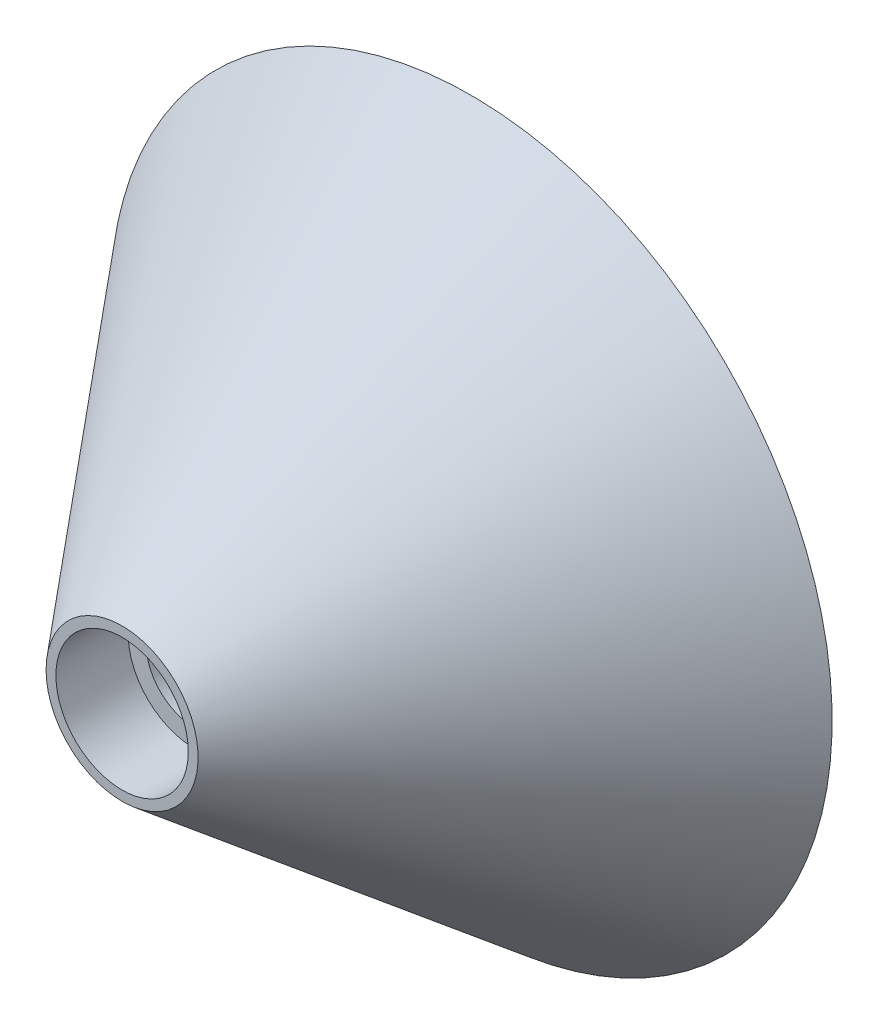
ISO-10303-21;
HEADER;
FILE_DESCRIPTION(('STEP AP214'),'2;1');
FILE_NAME('part.step','',(''),(''),'','','');
FILE_SCHEMA(('AUTOMOTIVE_DESIGN { 1 0 10303 214 1 1 1 1 }'));
ENDSEC;
DATA;
#1=APPLICATION_CONTEXT('core data for automotive mechanical design processes');
#2=APPLICATION_PROTOCOL_DEFINITION('international standard','automotive_design',2000,#1);
#3=PRODUCT_CONTEXT('',#1,'mechanical');
#4=PRODUCT('Part','Part','',(#3));
#5=PRODUCT_RELATED_PRODUCT_CATEGORY('part','',(#4));
#6=PRODUCT_DEFINITION_FORMATION('','',#4);
#7=PRODUCT_DEFINITION_CONTEXT('part definition',#1,'design');
#8=PRODUCT_DEFINITION('design','',#6,#7);
#9=PRODUCT_DEFINITION_SHAPE('','',#8);
#10=(LENGTH_UNIT() NAMED_UNIT(*) SI_UNIT(.MILLI.,.METRE.));
#11=(NAMED_UNIT(*) PLANE_ANGLE_UNIT() SI_UNIT($,.RADIAN.));
#12=(NAMED_UNIT(*) SI_UNIT($,.STERADIAN.) SOLID_ANGLE_UNIT());
#13=UNCERTAINTY_MEASURE_WITH_UNIT(LENGTH_MEASURE(1.E-05),#10,'distance_accuracy_value','');
#14=(GEOMETRIC_REPRESENTATION_CONTEXT(3) GLOBAL_UNCERTAINTY_ASSIGNED_CONTEXT((#13)) GLOBAL_UNIT_ASSIGNED_CONTEXT((#10,
#11,#12)) REPRESENTATION_CONTEXT('',''));
#15=CARTESIAN_POINT('',(0.,0.,0.));
#16=DIRECTION('',(0.,0.,1.));
#17=DIRECTION('',(1.,0.,0.));
#18=AXIS2_PLACEMENT_3D('',#15,#16,#17);
#19=CARTESIAN_POINT('',(0.,6.31672733205451,-1.28833674807951));
#20=DIRECTION('',(0.,0.,-1.));
#21=DIRECTION('',(-1.,0.,0.));
#22=AXIS2_PLACEMENT_3D('',#19,#20,#21);
#23=PLANE('',#22);
#24=CARTESIAN_POINT('',(0.,0.,-1.28833674807951));
#25=DIRECTION('',(0.,0.,1.));
#26=DIRECTION('',(1.,0.,0.));
#27=AXIS2_PLACEMENT_3D('',#24,#25,#26);
#28=CIRCLE('',#27,5.5);
#29=CARTESIAN_POINT('',(5.5,0.,-1.28833674807951));
#30=VERTEX_POINT('',#29);
#31=EDGE_CURVE('E10',#30,#30,#28,.T.);
#32=ORIENTED_EDGE('',*,*,#31,.F.);
#33=EDGE_LOOP('',(#32));
#34=FACE_BOUND('',#33,.T.);
#35=CARTESIAN_POINT('',(0.,0.,-1.28833674807951));
#36=DIRECTION('',(0.,0.,1.));
#37=DIRECTION('',(1.,0.,0.));
#38=AXIS2_PLACEMENT_3D('',#35,#36,#37);
#39=CIRCLE('',#38,6.31672733205451);
#40=CARTESIAN_POINT('',(-6.31672733205451,0.,-1.28833674807951));
#41=VERTEX_POINT('',#40);
#42=EDGE_CURVE('E58',#41,#41,#39,.T.);
#43=ORIENTED_EDGE('',*,*,#42,.T.);
#44=EDGE_LOOP('',(#43));
#45=FACE_BOUND('',#44,.T.);
#46=ADVANCED_FACE('F30',(#34,#45),#23,.F.);
#47=CARTESIAN_POINT('',(0.,0.,59.9597523601837));
#48=DIRECTION('',(0.,0.,1.));
#49=DIRECTION('',(1.,0.,0.));
#50=AXIS2_PLACEMENT_3D('',#47,#48,#49);
#51=CYLINDRICAL_SURFACE('',#50,5.5);
#52=CARTESIAN_POINT('',(0.,0.,-7.28833674807951));
#53=DIRECTION('',(0.,0.,1.));
#54=DIRECTION('',(1.,0.,0.));
#55=AXIS2_PLACEMENT_3D('',#52,#53,#54);
#56=CIRCLE('',#55,5.5);
#57=CARTESIAN_POINT('',(5.5,0.,-7.28833674807951));
#58=VERTEX_POINT('',#57);
#59=EDGE_CURVE('E36',#58,#58,#56,.T.);
#60=ORIENTED_EDGE('',*,*,#59,.F.);
#61=EDGE_LOOP('',(#60));
#62=FACE_BOUND('',#61,.T.);
#63=ORIENTED_EDGE('',*,*,#31,.T.);
#64=EDGE_LOOP('',(#63));
#65=FACE_BOUND('',#64,.T.);
#66=ADVANCED_FACE('F95',(#62,#65),#51,.F.);
#67=CARTESIAN_POINT('',(0.,5.5,-7.28833674807951));
#68=DIRECTION('',(0.,0.,-1.));
#69=DIRECTION('',(-1.,0.,0.));
#70=AXIS2_PLACEMENT_3D('',#67,#68,#69);
#71=PLANE('',#70);
#72=CARTESIAN_POINT('',(0.,0.,-7.28833674807951));
#73=DIRECTION('',(0.,0.,1.));
#74=DIRECTION('',(1.,0.,0.));
#75=AXIS2_PLACEMENT_3D('',#72,#73,#74);
#76=CIRCLE('',#75,4.);
#77=CARTESIAN_POINT('',(4.,0.,-7.28833674807951));
#78=VERTEX_POINT('',#77);
#79=EDGE_CURVE('E40',#78,#78,#76,.T.);
#80=ORIENTED_EDGE('',*,*,#79,.F.);
#81=EDGE_LOOP('',(#80));
#82=FACE_BOUND('',#81,.T.);
#83=ORIENTED_EDGE('',*,*,#59,.T.);
#84=EDGE_LOOP('',(#83));
#85=FACE_BOUND('',#84,.T.);
#86=ADVANCED_FACE('F90',(#82,#85),#71,.F.);
#87=CARTESIAN_POINT('',(0.,0.,59.9597523601837));
#88=DIRECTION('',(0.,0.,1.));
#89=DIRECTION('',(1.,0.,0.));
#90=AXIS2_PLACEMENT_3D('',#87,#88,#89);
#91=CYLINDRICAL_SURFACE('',#90,4.);
#92=CARTESIAN_POINT('',(0.,0.,-24.2882624639311));
#93=DIRECTION('',(0.,0.,1.));
#94=DIRECTION('',(1.,0.,0.));
#95=AXIS2_PLACEMENT_3D('',#92,#93,#94);
#96=CIRCLE('',#95,4.);
#97=CARTESIAN_POINT('',(4.,0.,-24.2882624639311));
#98=VERTEX_POINT('',#97);
#99=EDGE_CURVE('E44',#98,#98,#96,.T.);
#100=ORIENTED_EDGE('',*,*,#99,.F.);
#101=EDGE_LOOP('',(#100));
#102=FACE_BOUND('',#101,.T.);
#103=ORIENTED_EDGE('',*,*,#79,.T.);
#104=EDGE_LOOP('',(#103));
#105=FACE_BOUND('',#104,.T.);
#106=ADVANCED_FACE('F84',(#102,#105),#91,.F.);
#107=CARTESIAN_POINT('',(0.,5.5,-24.2882624639311));
#108=DIRECTION('',(0.,0.,1.));
#109=DIRECTION('',(1.,0.,0.));
#110=AXIS2_PLACEMENT_3D('',#107,#108,#109);
#111=PLANE('',#110);
#112=CARTESIAN_POINT('',(0.,0.,-24.2882624639311));
#113=DIRECTION('',(0.,0.,1.));
#114=DIRECTION('',(1.,0.,0.));
#115=AXIS2_PLACEMENT_3D('',#112,#113,#114);
#116=CIRCLE('',#115,5.5);
#117=CARTESIAN_POINT('',(5.5,0.,-24.2882624639311));
#118=VERTEX_POINT('',#117);
#119=EDGE_CURVE('E49',#118,#118,#116,.T.);
#120=ORIENTED_EDGE('',*,*,#119,.F.);
#121=EDGE_LOOP('',(#120));
#122=FACE_BOUND('',#121,.T.);
#123=ORIENTED_EDGE('',*,*,#99,.T.);
#124=EDGE_LOOP('',(#123));
#125=FACE_BOUND('',#124,.T.);
#126=ADVANCED_FACE('F78',(#122,#125),#111,.F.);
#127=CARTESIAN_POINT('',(0.,0.,59.9597523601837));
#128=DIRECTION('',(0.,0.,1.));
#129=DIRECTION('',(1.,0.,0.));
#130=AXIS2_PLACEMENT_3D('',#127,#128,#129);
#131=CYLINDRICAL_SURFACE('',#130,5.5);
#132=CARTESIAN_POINT('',(0.,0.,-30.2882624639311));
#133=DIRECTION('',(0.,0.,1.));
#134=DIRECTION('',(1.,0.,0.));
#135=AXIS2_PLACEMENT_3D('',#132,#133,#134);
#136=CIRCLE('',#135,5.5);
#137=CARTESIAN_POINT('',(5.5,0.,-30.2882624639311));
#138=VERTEX_POINT('',#137);
#139=EDGE_CURVE('E52',#138,#138,#136,.T.);
#140=ORIENTED_EDGE('',*,*,#139,.F.);
#141=EDGE_LOOP('',(#140));
#142=FACE_BOUND('',#141,.T.);
#143=ORIENTED_EDGE('',*,*,#119,.T.);
#144=EDGE_LOOP('',(#143));
#145=FACE_BOUND('',#144,.T.);
#146=ADVANCED_FACE('F72',(#142,#145),#131,.F.);
#147=CARTESIAN_POINT('',(0.,5.5,-30.2882624639311));
#148=DIRECTION('',(0.,0.,1.));
#149=DIRECTION('',(1.,0.,0.));
#150=AXIS2_PLACEMENT_3D('',#147,#148,#149);
#151=PLANE('',#150);
#152=CARTESIAN_POINT('',(0.,0.,-30.2882624639311));
#153=DIRECTION('',(0.,0.,1.));
#154=DIRECTION('',(1.,0.,0.));
#155=AXIS2_PLACEMENT_3D('',#152,#153,#154);
#156=CIRCLE('',#155,30.);
#157=CARTESIAN_POINT('',(-30.,0.,-30.2882624639311));
#158=VERTEX_POINT('',#157);
#159=EDGE_CURVE('E55',#158,#158,#156,.T.);
#160=ORIENTED_EDGE('',*,*,#159,.F.);
#161=EDGE_LOOP('',(#160));
#162=FACE_BOUND('',#161,.T.);
#163=ORIENTED_EDGE('',*,*,#139,.T.);
#164=EDGE_LOOP('',(#163));
#165=FACE_BOUND('',#164,.T.);
#166=ADVANCED_FACE('F66',(#162,#165),#151,.F.);
#167=CARTESIAN_POINT('',(0.,0.,-30.2882624639311));
#168=DIRECTION('',(0.,0.,-1.));
#169=DIRECTION('',(-1.,0.,0.));
#170=AXIS2_PLACEMENT_3D('',#167,#168,#169);
#171=CONICAL_SURFACE('',#170,30.,0.6848212459426);
#172=CARTESIAN_POINT('',(-6.31672733205451,0.,-1.28833674807951));
#173=CARTESIAN_POINT('',(-6.56342808901227,0.,-1.59041930761963));
#174=CARTESIAN_POINT('',(-6.81012884597004,0.,-1.89250186715975));
#175=CARTESIAN_POINT('',(-7.30353035988557,0.,-2.49666698623999));
#176=CARTESIAN_POINT('',(-7.55023111684334,0.,-2.79874954578011));
#177=CARTESIAN_POINT('',(-8.04363263075887,0.,-3.40291466486036));
#178=CARTESIAN_POINT('',(-8.29033338771663,0.,-3.70499722440048));
#179=CARTESIAN_POINT('',(-8.78373490163216,0.,-4.30916234348072));
#180=CARTESIAN_POINT('',(-9.03043565858993,0.,-4.61124490302084));
#181=CARTESIAN_POINT('',(-9.52383717250546,0.,-5.21541002210108));
#182=CARTESIAN_POINT('',(-9.77053792946322,0.,-5.5174925816412));
#183=CARTESIAN_POINT('',(-10.2639394433788,0.,-6.12165770072145));
#184=CARTESIAN_POINT('',(-10.5106402003365,0.,-6.42374026026157));
#185=CARTESIAN_POINT('',(-11.0040417142521,0.,-7.02790537934181));
#186=CARTESIAN_POINT('',(-11.2507424712098,0.,-7.32998793888193));
#187=CARTESIAN_POINT('',(-11.7441439851253,0.,-7.93415305796217));
#188=CARTESIAN_POINT('',(-11.9908447420831,0.,-8.23623561750229));
#189=CARTESIAN_POINT('',(-12.4842462559986,0.,-8.84040073658254));
#190=CARTESIAN_POINT('',(-12.7309470129564,0.,-9.14248329612266));
#191=CARTESIAN_POINT('',(-13.2243485268719,0.,-9.7466484152029));
#192=CARTESIAN_POINT('',(-13.4710492838297,0.,-10.048730974743));
#193=CARTESIAN_POINT('',(-13.9644507977452,0.,-10.6528960938233));
#194=CARTESIAN_POINT('',(-14.211151554703,0.,-10.9549786533634));
#195=CARTESIAN_POINT('',(-14.7045530686185,0.,-11.5591437724436));
#196=CARTESIAN_POINT('',(-14.9512538255763,0.,-11.8612263319837));
#197=CARTESIAN_POINT('',(-15.4446553394918,0.,-12.465391451064));
#198=CARTESIAN_POINT('',(-15.6913560964496,0.,-12.7674740106041));
#199=CARTESIAN_POINT('',(-16.1847576103651,0.,-13.3716391296844));
#200=CARTESIAN_POINT('',(-16.4314583673229,0.,-13.6737216892245));
#201=CARTESIAN_POINT('',(-16.9248598812384,0.,-14.2778868083047));
#202=CARTESIAN_POINT('',(-17.1715606381962,0.,-14.5799693678448));
#203=CARTESIAN_POINT('',(-17.6649621521117,0.,-15.1841344869251));
#204=CARTESIAN_POINT('',(-17.9116629090695,0.,-15.4862170464652));
#205=CARTESIAN_POINT('',(-18.405064422985,0.,-16.0903821655454));
#206=CARTESIAN_POINT('',(-18.6517651799428,0.,-16.3924647250856));
#207=CARTESIAN_POINT('',(-19.1451666938583,0.,-16.9966298441658));
#208=CARTESIAN_POINT('',(-19.3918674508161,0.,-17.2987124037059));
#209=CARTESIAN_POINT('',(-19.8852689647316,0.,-17.9028775227862));
#210=CARTESIAN_POINT('',(-20.1319697216894,0.,-18.2049600823263));
#211=CARTESIAN_POINT('',(-20.6253712356049,0.,-18.8091252014065));
#212=CARTESIAN_POINT('',(-20.8720719925627,0.,-19.1112077609467));
#213=CARTESIAN_POINT('',(-21.3654735064782,0.,-19.7153728800269));
#214=CARTESIAN_POINT('',(-21.612174263436,0.,-20.017455439567));
#215=CARTESIAN_POINT('',(-22.1055757773515,0.,-20.6216205586473));
#216=CARTESIAN_POINT('',(-22.3522765343093,0.,-20.9237031181874));
#217=CARTESIAN_POINT('',(-22.8456780482248,0.,-21.5278682372676));
#218=CARTESIAN_POINT('',(-23.0923788051826,0.,-21.8299507968077));
#219=CARTESIAN_POINT('',(-23.5857803190981,0.,-22.434115915888));
#220=CARTESIAN_POINT('',(-23.8324810760559,0.,-22.7361984754281));
#221=CARTESIAN_POINT('',(-24.3258825899714,0.,-23.3403635945083));
#222=CARTESIAN_POINT('',(-24.5725833469292,0.,-23.6424461540485));
#223=CARTESIAN_POINT('',(-25.0659848608447,0.,-24.2466112731287));
#224=CARTESIAN_POINT('',(-25.3126856178025,0.,-24.5486938326688));
#225=CARTESIAN_POINT('',(-25.806087131718,0.,-25.1528589517491));
#226=CARTESIAN_POINT('',(-26.0527878886758,0.,-25.4549415112892));
#227=CARTESIAN_POINT('',(-26.5461894025913,0.,-26.0591066303694));
#228=CARTESIAN_POINT('',(-26.792890159549,0.,-26.3611891899096));
#229=CARTESIAN_POINT('',(-27.2862916734646,0.,-26.9653543089898));
#230=CARTESIAN_POINT('',(-27.5329924304223,0.,-27.2674368685299));
#231=CARTESIAN_POINT('',(-28.0263939443379,0.,-27.8716019876102));
#232=CARTESIAN_POINT('',(-28.2730947012956,0.,-28.1736845471503));
#233=CARTESIAN_POINT('',(-28.7664962152112,0.,-28.7778496662305));
#234=CARTESIAN_POINT('',(-29.0131969721689,0.,-29.0799322257706));
#235=CARTESIAN_POINT('',(-29.5065984860845,0.,-29.6840973448509));
#236=CARTESIAN_POINT('',(-29.7532992430422,0.,-29.986179904391));
#237=CARTESIAN_POINT('',(-30.,0.,-30.2882624639311));
#238=B_SPLINE_CURVE_WITH_KNOTS('',3,(#172,#173,#174,#175,#176,#177,#178,#179,#180,#181,#182,
#183,#184,#185,#186,#187,#188,#189,#190,#191,#192,#193,#194,#195,#196,#197,#198,#199,#200,#201,
#202,#203,#204,#205,#206,#207,#208,#209,#210,#211,#212,#213,#214,#215,#216,#217,#218,#219,#220,
#221,#222,#223,#224,#225,#226,#227,#228,#229,#230,#231,#232,#233,#234,#235,#236,#237),
.UNSPECIFIED.,.F.,.F.,(4,2,2,2,2,2,2,2,2,2,2,2,2,2,2,2,2,2,2,2,2,2,2,2,2,2,2,2,2,2,2,2,4),(0.,
1.17005821494343,2.34011642988686,3.51017464483029,4.68023285977372,5.85029107471715,
7.02034928966058,8.19040750460402,9.36046571954745,10.5305239344909,11.7005821494343,
12.8706403643777,14.0406985793212,15.2107567942646,16.380815009208,17.5508732241515,
18.7209314390949,19.8909896540383,21.0610478689817,22.2311060839252,23.4011642988686,
24.571222513812,25.7412807287555,26.9113389436989,28.0813971586423,29.2514553735858,
30.4215135885292,31.5915718034726,32.7616300184161,33.9316882333595,35.1017464483029,
36.2718046632463,37.4418628781898),.UNSPECIFIED.);
#239=EDGE_CURVE('BSEAM63',#41,#158,#238,.T.);
#240=ORIENTED_EDGE('',*,*,#42,.F.);
#241=ORIENTED_EDGE('',*,*,#159,.T.);
#242=ORIENTED_EDGE('',*,*,#239,.T.);
#243=ORIENTED_EDGE('',*,*,#239,.F.);
#244=EDGE_LOOP('',(#240,#242,#241,#243));
#245=FACE_BOUND('',#244,.T.);
#246=ADVANCED_FACE('F63',(#245),#171,.T.);
#247=CLOSED_SHELL('',(#46,#66,#86,#106,#126,#146,#166,#246));
#248=MANIFOLD_SOLID_BREP('B2',#247);
#249=ADVANCED_BREP_SHAPE_REPRESENTATION('',(#18,#248),#14);
#250=SHAPE_DEFINITION_REPRESENTATION(#9,#249);
ENDSEC;
END-ISO-10303-21;
